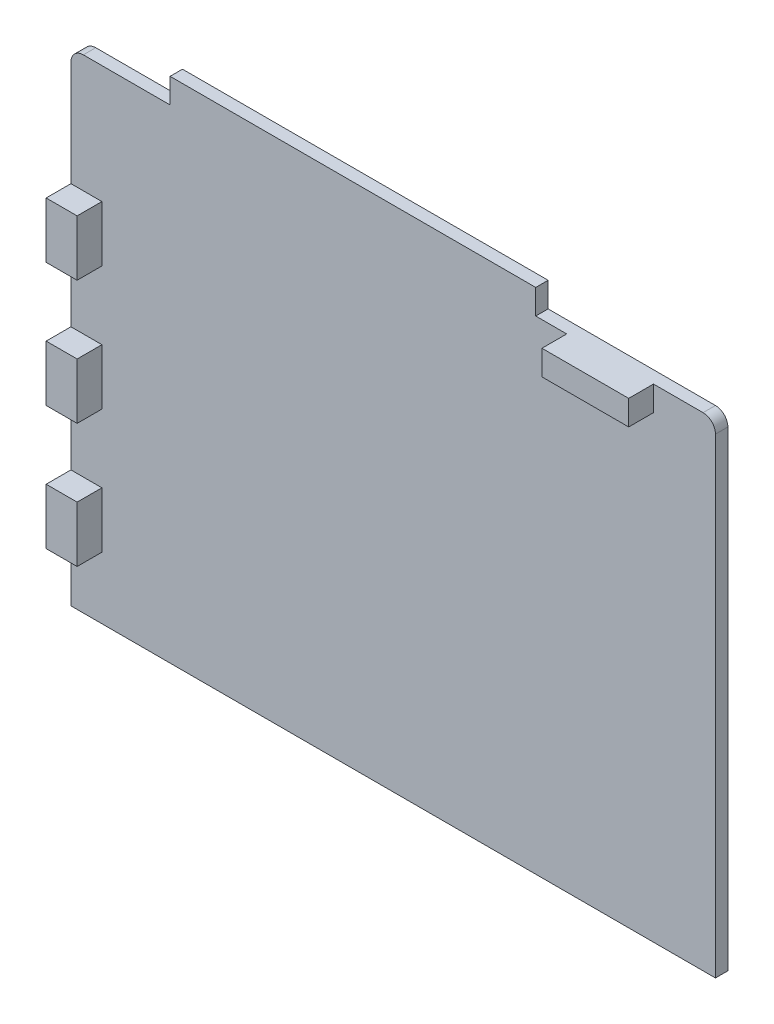
ISO-10303-21;
HEADER;
FILE_DESCRIPTION(('STEP AP214'),'2;1');
FILE_NAME('part.step','',(''),(''),'','','');
FILE_SCHEMA(('AUTOMOTIVE_DESIGN { 1 0 10303 214 1 1 1 1 }'));
ENDSEC;
DATA;
#1=APPLICATION_CONTEXT('core data for automotive mechanical design processes');
#2=APPLICATION_PROTOCOL_DEFINITION('international standard','automotive_design',2000,#1);
#3=PRODUCT_CONTEXT('',#1,'mechanical');
#4=PRODUCT('Part','Part','',(#3));
#5=PRODUCT_RELATED_PRODUCT_CATEGORY('part','',(#4));
#6=PRODUCT_DEFINITION_FORMATION('','',#4);
#7=PRODUCT_DEFINITION_CONTEXT('part definition',#1,'design');
#8=PRODUCT_DEFINITION('design','',#6,#7);
#9=PRODUCT_DEFINITION_SHAPE('','',#8);
#10=(LENGTH_UNIT() NAMED_UNIT(*) SI_UNIT(.MILLI.,.METRE.));
#11=(NAMED_UNIT(*) PLANE_ANGLE_UNIT() SI_UNIT($,.RADIAN.));
#12=(NAMED_UNIT(*) SI_UNIT($,.STERADIAN.) SOLID_ANGLE_UNIT());
#13=UNCERTAINTY_MEASURE_WITH_UNIT(LENGTH_MEASURE(1.E-05),#10,'distance_accuracy_value','');
#14=(GEOMETRIC_REPRESENTATION_CONTEXT(3) GLOBAL_UNCERTAINTY_ASSIGNED_CONTEXT((#13)) GLOBAL_UNIT_ASSIGNED_CONTEXT((#10,
#11,#12)) REPRESENTATION_CONTEXT('',''));
#15=CARTESIAN_POINT('',(0.,0.,0.));
#16=DIRECTION('',(0.,0.,1.));
#17=DIRECTION('',(1.,0.,0.));
#18=AXIS2_PLACEMENT_3D('',#15,#16,#17);
#19=CARTESIAN_POINT('',(-15.9067749788197,-11.1489450784484,0.));
#20=DIRECTION('',(-1.,0.,0.));
#21=DIRECTION('',(0.,1.,0.));
#22=AXIS2_PLACEMENT_3D('',#19,#20,#21);
#23=PLANE('',#22);
#24=DIRECTION('',(0.,-1.,0.));
#25=VECTOR('',#24,1.);
#26=CARTESIAN_POINT('',(-15.9067749788197,-5.53896634470686,0.));
#27=LINE('',#26,#25);
#28=CARTESIAN_POINT('',(-15.9067749788197,-5.53896634470686,0.));
#29=VERTEX_POINT('',#28);
#30=CARTESIAN_POINT('',(-15.9067749788197,-11.1489450784484,0.));
#31=VERTEX_POINT('',#30);
#32=EDGE_CURVE('E11',#29,#31,#27,.T.);
#33=ORIENTED_EDGE('',*,*,#32,.F.);
#34=DIRECTION('',(0.,0.,-1.));
#35=VECTOR('',#34,1.);
#36=CARTESIAN_POINT('',(-15.9067749788197,-5.53896634470686,0.));
#37=LINE('',#36,#35);
#38=CARTESIAN_POINT('',(-15.9067749788197,-5.53896634470686,-1.5));
#39=VERTEX_POINT('',#38);
#40=EDGE_CURVE('E25',#29,#39,#37,.T.);
#41=ORIENTED_EDGE('',*,*,#40,.T.);
#42=DIRECTION('',(0.,1.,0.));
#43=VECTOR('',#42,1.);
#44=CARTESIAN_POINT('',(-15.9067749788197,-11.1489450784484,-1.5));
#45=LINE('',#44,#43);
#46=CARTESIAN_POINT('',(-15.9067749788197,-11.1489450784484,-1.5));
#47=VERTEX_POINT('',#46);
#48=EDGE_CURVE('E612',#47,#39,#45,.T.);
#49=ORIENTED_EDGE('',*,*,#48,.F.);
#50=DIRECTION('',(0.,0.,-1.));
#51=VECTOR('',#50,1.);
#52=CARTESIAN_POINT('',(-15.9067749788197,-11.1489450784484,0.));
#53=LINE('',#52,#51);
#54=EDGE_CURVE('E607',#31,#47,#53,.T.);
#55=ORIENTED_EDGE('',*,*,#54,.F.);
#56=EDGE_LOOP('',(#33,#41,#49,#55));
#57=FACE_BOUND('',#56,.T.);
#58=ADVANCED_FACE('F17',(#57),#23,.T.);
#59=CARTESIAN_POINT('',(5.96504061705738,-11.1489450784484,0.));
#60=DIRECTION('',(0.,-1.,0.));
#61=DIRECTION('',(-1.,0.,0.));
#62=AXIS2_PLACEMENT_3D('',#59,#60,#61);
#63=PLANE('',#62);
#64=DIRECTION('',(1.,0.,0.));
#65=VECTOR('',#64,1.);
#66=CARTESIAN_POINT('',(-15.9067749788197,-11.1489450784484,0.));
#67=LINE('',#66,#65);
#68=CARTESIAN_POINT('',(5.96504061705738,-11.1489450784484,0.));
#69=VERTEX_POINT('',#68);
#70=EDGE_CURVE('E602',#31,#69,#67,.T.);
#71=ORIENTED_EDGE('',*,*,#70,.F.);
#72=ORIENTED_EDGE('',*,*,#54,.T.);
#73=DIRECTION('',(-1.,0.,0.));
#74=VECTOR('',#73,1.);
#75=CARTESIAN_POINT('',(5.96504061705738,-11.1489450784484,-1.5));
#76=LINE('',#75,#74);
#77=CARTESIAN_POINT('',(5.96504061705738,-11.1489450784484,-1.5));
#78=VERTEX_POINT('',#77);
#79=EDGE_CURVE('E597',#78,#47,#76,.T.);
#80=ORIENTED_EDGE('',*,*,#79,.F.);
#81=DIRECTION('',(0.,0.,-1.));
#82=VECTOR('',#81,1.);
#83=CARTESIAN_POINT('',(5.96504061705738,-11.1489450784484,0.));
#84=LINE('',#83,#82);
#85=EDGE_CURVE('E592',#69,#78,#84,.T.);
#86=ORIENTED_EDGE('',*,*,#85,.F.);
#87=EDGE_LOOP('',(#71,#72,#80,#86));
#88=FACE_BOUND('',#87,.T.);
#89=ADVANCED_FACE('F625',(#88),#63,.T.);
#90=CARTESIAN_POINT('',(5.96504061705738,-5.53896634470686,0.));
#91=DIRECTION('',(1.,0.,0.));
#92=DIRECTION('',(0.,-1.,0.));
#93=AXIS2_PLACEMENT_3D('',#90,#91,#92);
#94=PLANE('',#93);
#95=DIRECTION('',(0.,1.,0.));
#96=VECTOR('',#95,1.);
#97=CARTESIAN_POINT('',(5.96504061705738,-11.1489450784484,0.));
#98=LINE('',#97,#96);
#99=CARTESIAN_POINT('',(5.96504061705738,-5.53896634470686,0.));
#100=VERTEX_POINT('',#99);
#101=EDGE_CURVE('E587',#69,#100,#98,.T.);
#102=ORIENTED_EDGE('',*,*,#101,.F.);
#103=ORIENTED_EDGE('',*,*,#85,.T.);
#104=DIRECTION('',(0.,-1.,0.));
#105=VECTOR('',#104,1.);
#106=CARTESIAN_POINT('',(5.96504061705738,-5.53896634470686,-1.5));
#107=LINE('',#106,#105);
#108=CARTESIAN_POINT('',(5.96504061705738,-5.53896634470686,-1.5));
#109=VERTEX_POINT('',#108);
#110=EDGE_CURVE('E582',#109,#78,#107,.T.);
#111=ORIENTED_EDGE('',*,*,#110,.F.);
#112=DIRECTION('',(0.,0.,-1.));
#113=VECTOR('',#112,1.);
#114=CARTESIAN_POINT('',(5.96504061705738,-5.53896634470686,0.));
#115=LINE('',#114,#113);
#116=EDGE_CURVE('E577',#100,#109,#115,.T.);
#117=ORIENTED_EDGE('',*,*,#116,.F.);
#118=EDGE_LOOP('',(#102,#103,#111,#117));
#119=FACE_BOUND('',#118,.T.);
#120=ADVANCED_FACE('F633',(#119),#94,.T.);
#121=CARTESIAN_POINT('',(-15.9067749788197,-5.53896634470686,0.));
#122=DIRECTION('',(0.,1.,0.));
#123=DIRECTION('',(1.,0.,0.));
#124=AXIS2_PLACEMENT_3D('',#121,#122,#123);
#125=PLANE('',#124);
#126=DIRECTION('',(-1.,0.,0.));
#127=VECTOR('',#126,1.);
#128=CARTESIAN_POINT('',(5.96504061705738,-5.53896634470686,0.));
#129=LINE('',#128,#127);
#130=EDGE_CURVE('E572',#100,#29,#129,.T.);
#131=ORIENTED_EDGE('',*,*,#130,.F.);
#132=ORIENTED_EDGE('',*,*,#116,.T.);
#133=DIRECTION('',(1.,0.,0.));
#134=VECTOR('',#133,1.);
#135=CARTESIAN_POINT('',(-15.9067749788197,-5.53896634470686,-1.5));
#136=LINE('',#135,#134);
#137=EDGE_CURVE('E567',#39,#109,#136,.T.);
#138=ORIENTED_EDGE('',*,*,#137,.F.);
#139=ORIENTED_EDGE('',*,*,#40,.F.);
#140=EDGE_LOOP('',(#131,#132,#138,#139));
#141=FACE_BOUND('',#140,.T.);
#142=ADVANCED_FACE('F631',(#141),#125,.T.);
#143=CARTESIAN_POINT('',(-4.97086718088115,-8.34395571157763,-1.5));
#144=DIRECTION('',(0.,0.,-1.));
#145=DIRECTION('',(-1.,0.,0.));
#146=AXIS2_PLACEMENT_3D('',#143,#144,#145);
#147=PLANE('',#146);
#148=ORIENTED_EDGE('',*,*,#137,.T.);
#149=ORIENTED_EDGE('',*,*,#110,.T.);
#150=ORIENTED_EDGE('',*,*,#79,.T.);
#151=ORIENTED_EDGE('',*,*,#48,.T.);
#152=EDGE_LOOP('',(#148,#149,#150,#151));
#153=FACE_BOUND('',#152,.T.);
#154=ADVANCED_FACE('F622',(#153),#147,.T.);
#155=CARTESIAN_POINT('',(0.,0.,0.));
#156=DIRECTION('',(0.,0.,1.));
#157=DIRECTION('',(1.,0.,0.));
#158=AXIS2_PLACEMENT_3D('',#155,#156,#157);
#159=PLANE('',#158);
#160=CARTESIAN_POINT('',(-25.,17.5,0.));
#161=DIRECTION('',(0.,0.,1.));
#162=DIRECTION('',(-0.707106781186549,0.707106781186546,0.));
#163=AXIS2_PLACEMENT_3D('',#160,#161,#162);
#164=CIRCLE('',#163,1.);
#165=CARTESIAN_POINT('',(-25.,18.5,0.));
#166=VERTEX_POINT('',#165);
#167=CARTESIAN_POINT('',(-26.,17.5,0.));
#168=VERTEX_POINT('',#167);
#169=EDGE_CURVE('E562',#166,#168,#164,.T.);
#170=ORIENTED_EDGE('',*,*,#169,.F.);
#171=DIRECTION('',(1.,0.,0.));
#172=VECTOR('',#171,1.);
#173=CARTESIAN_POINT('',(-25.,18.5,0.));
#174=LINE('',#173,#172);
#175=CARTESIAN_POINT('',(-18.,18.5,0.));
#176=VERTEX_POINT('',#175);
#177=EDGE_CURVE('E558',#166,#176,#174,.T.);
#178=ORIENTED_EDGE('',*,*,#177,.T.);
#179=DIRECTION('',(0.,1.,0.));
#180=VECTOR('',#179,1.);
#181=CARTESIAN_POINT('',(-18.,18.5,0.));
#182=LINE('',#181,#180);
#183=CARTESIAN_POINT('',(-18.,20.5,0.));
#184=VERTEX_POINT('',#183);
#185=EDGE_CURVE('E554',#176,#184,#182,.T.);
#186=ORIENTED_EDGE('',*,*,#185,.T.);
#187=DIRECTION('',(-1.,0.,0.));
#188=VECTOR('',#187,1.);
#189=CARTESIAN_POINT('',(11.5,20.5,0.));
#190=LINE('',#189,#188);
#191=CARTESIAN_POINT('',(11.5,20.5,0.));
#192=VERTEX_POINT('',#191);
#193=EDGE_CURVE('E549',#192,#184,#190,.T.);
#194=ORIENTED_EDGE('',*,*,#193,.F.);
#195=DIRECTION('',(0.,-1.,0.));
#196=VECTOR('',#195,1.);
#197=CARTESIAN_POINT('',(11.5,20.5,0.));
#198=LINE('',#197,#196);
#199=CARTESIAN_POINT('',(11.5,18.5,0.));
#200=VERTEX_POINT('',#199);
#201=EDGE_CURVE('E545',#192,#200,#198,.T.);
#202=ORIENTED_EDGE('',*,*,#201,.T.);
#203=DIRECTION('',(1.,0.,0.));
#204=VECTOR('',#203,1.);
#205=CARTESIAN_POINT('',(11.5,18.5,0.));
#206=LINE('',#205,#204);
#207=CARTESIAN_POINT('',(25.,18.5,0.));
#208=VERTEX_POINT('',#207);
#209=EDGE_CURVE('E541',#200,#208,#206,.T.);
#210=ORIENTED_EDGE('',*,*,#209,.T.);
#211=CARTESIAN_POINT('',(25.,17.5,0.));
#212=DIRECTION('',(0.,0.,1.));
#213=DIRECTION('',(0.707106781186546,0.707106781186549,0.));
#214=AXIS2_PLACEMENT_3D('',#211,#212,#213);
#215=CIRCLE('',#214,1.);
#216=CARTESIAN_POINT('',(26.,17.5,0.));
#217=VERTEX_POINT('',#216);
#218=EDGE_CURVE('E536',#217,#208,#215,.T.);
#219=ORIENTED_EDGE('',*,*,#218,.F.);
#220=DIRECTION('',(0.,1.,0.));
#221=VECTOR('',#220,1.);
#222=CARTESIAN_POINT('',(26.,-20.5,0.));
#223=LINE('',#222,#221);
#224=CARTESIAN_POINT('',(26.,-20.5,0.));
#225=VERTEX_POINT('',#224);
#226=EDGE_CURVE('E531',#225,#217,#223,.T.);
#227=ORIENTED_EDGE('',*,*,#226,.F.);
#228=DIRECTION('',(1.,0.,0.));
#229=VECTOR('',#228,1.);
#230=CARTESIAN_POINT('',(-26.,-20.5,0.));
#231=LINE('',#230,#229);
#232=CARTESIAN_POINT('',(-26.,-20.5,0.));
#233=VERTEX_POINT('',#232);
#234=EDGE_CURVE('E526',#233,#225,#231,.T.);
#235=ORIENTED_EDGE('',*,*,#234,.F.);
#236=DIRECTION('',(0.,-1.,0.));
#237=VECTOR('',#236,1.);
#238=CARTESIAN_POINT('',(-26.,17.5,0.));
#239=LINE('',#238,#237);
#240=EDGE_CURVE('E521',#168,#233,#239,.T.);
#241=ORIENTED_EDGE('',*,*,#240,.F.);
#242=EDGE_LOOP('',(#170,#178,#186,#194,#202,#210,#219,#227,#235,#241));
#243=FACE_BOUND('',#242,.T.);
#244=ORIENTED_EDGE('',*,*,#32,.T.);
#245=ORIENTED_EDGE('',*,*,#70,.T.);
#246=ORIENTED_EDGE('',*,*,#101,.T.);
#247=ORIENTED_EDGE('',*,*,#130,.T.);
#248=EDGE_LOOP('',(#244,#245,#246,#247));
#249=FACE_BOUND('',#248,.T.);
#250=ADVANCED_FACE('F628',(#243,#249),#159,.F.);
#251=CARTESIAN_POINT('',(-26.,20.5,0.));
#252=DIRECTION('',(-1.,0.,0.));
#253=DIRECTION('',(0.,-1.,0.));
#254=AXIS2_PLACEMENT_3D('',#251,#252,#253);
#255=PLANE('',#254);
#256=DIRECTION('',(0.,0.,1.));
#257=VECTOR('',#256,1.);
#258=CARTESIAN_POINT('',(-26.,17.5,0.));
#259=LINE('',#258,#257);
#260=CARTESIAN_POINT('',(-26.,17.5,1.));
#261=VERTEX_POINT('',#260);
#262=EDGE_CURVE('E516',#168,#261,#259,.T.);
#263=ORIENTED_EDGE('',*,*,#262,.F.);
#264=ORIENTED_EDGE('',*,*,#240,.T.);
#265=DIRECTION('',(0.,0.,1.));
#266=VECTOR('',#265,1.);
#267=CARTESIAN_POINT('',(-26.,-20.5,0.));
#268=LINE('',#267,#266);
#269=CARTESIAN_POINT('',(-26.,-20.5,1.));
#270=VERTEX_POINT('',#269);
#271=EDGE_CURVE('E512',#233,#270,#268,.T.);
#272=ORIENTED_EDGE('',*,*,#271,.T.);
#273=DIRECTION('',(0.,-1.,0.));
#274=VECTOR('',#273,1.);
#275=CARTESIAN_POINT('',(-26.,-15.5,1.));
#276=LINE('',#275,#274);
#277=CARTESIAN_POINT('',(-26.,-15.5,1.));
#278=VERTEX_POINT('',#277);
#279=EDGE_CURVE('E507',#278,#270,#276,.T.);
#280=ORIENTED_EDGE('',*,*,#279,.F.);
#281=DIRECTION('',(0.,0.,1.));
#282=VECTOR('',#281,1.);
#283=CARTESIAN_POINT('',(-26.,-15.5,1.));
#284=LINE('',#283,#282);
#285=CARTESIAN_POINT('',(-26.,-15.5,3.));
#286=VERTEX_POINT('',#285);
#287=EDGE_CURVE('E503',#278,#286,#284,.T.);
#288=ORIENTED_EDGE('',*,*,#287,.T.);
#289=DIRECTION('',(0.,-1.,0.));
#290=VECTOR('',#289,1.);
#291=CARTESIAN_POINT('',(-26.,-11.,3.));
#292=LINE('',#291,#290);
#293=CARTESIAN_POINT('',(-26.,-11.,3.));
#294=VERTEX_POINT('',#293);
#295=EDGE_CURVE('E498',#294,#286,#292,.T.);
#296=ORIENTED_EDGE('',*,*,#295,.F.);
#297=DIRECTION('',(0.,0.,1.));
#298=VECTOR('',#297,1.);
#299=CARTESIAN_POINT('',(-26.,-11.,1.));
#300=LINE('',#299,#298);
#301=CARTESIAN_POINT('',(-26.,-11.,1.));
#302=VERTEX_POINT('',#301);
#303=EDGE_CURVE('E493',#302,#294,#300,.T.);
#304=ORIENTED_EDGE('',*,*,#303,.F.);
#305=DIRECTION('',(0.,-1.,0.));
#306=VECTOR('',#305,1.);
#307=CARTESIAN_POINT('',(-26.,-5.5,1.));
#308=LINE('',#307,#306);
#309=CARTESIAN_POINT('',(-26.,-5.5,1.));
#310=VERTEX_POINT('',#309);
#311=EDGE_CURVE('E488',#310,#302,#308,.T.);
#312=ORIENTED_EDGE('',*,*,#311,.F.);
#313=DIRECTION('',(0.,0.,1.));
#314=VECTOR('',#313,1.);
#315=CARTESIAN_POINT('',(-26.,-5.5,1.));
#316=LINE('',#315,#314);
#317=CARTESIAN_POINT('',(-26.,-5.5,3.));
#318=VERTEX_POINT('',#317);
#319=EDGE_CURVE('E484',#310,#318,#316,.T.);
#320=ORIENTED_EDGE('',*,*,#319,.T.);
#321=DIRECTION('',(0.,-1.,0.));
#322=VECTOR('',#321,1.);
#323=CARTESIAN_POINT('',(-26.,-1.,3.));
#324=LINE('',#323,#322);
#325=CARTESIAN_POINT('',(-26.,-1.,3.));
#326=VERTEX_POINT('',#325);
#327=EDGE_CURVE('E479',#326,#318,#324,.T.);
#328=ORIENTED_EDGE('',*,*,#327,.F.);
#329=DIRECTION('',(0.,0.,1.));
#330=VECTOR('',#329,1.);
#331=CARTESIAN_POINT('',(-26.,-1.,1.));
#332=LINE('',#331,#330);
#333=CARTESIAN_POINT('',(-26.,-1.,1.));
#334=VERTEX_POINT('',#333);
#335=EDGE_CURVE('E474',#334,#326,#332,.T.);
#336=ORIENTED_EDGE('',*,*,#335,.F.);
#337=DIRECTION('',(0.,-1.,0.));
#338=VECTOR('',#337,1.);
#339=CARTESIAN_POINT('',(-26.,4.49999999999999,1.));
#340=LINE('',#339,#338);
#341=CARTESIAN_POINT('',(-26.,4.49999999999999,1.));
#342=VERTEX_POINT('',#341);
#343=EDGE_CURVE('E469',#342,#334,#340,.T.);
#344=ORIENTED_EDGE('',*,*,#343,.F.);
#345=DIRECTION('',(0.,0.,1.));
#346=VECTOR('',#345,1.);
#347=CARTESIAN_POINT('',(-26.,4.49999999999999,1.));
#348=LINE('',#347,#346);
#349=CARTESIAN_POINT('',(-26.,4.49999999999999,3.));
#350=VERTEX_POINT('',#349);
#351=EDGE_CURVE('E465',#342,#350,#348,.T.);
#352=ORIENTED_EDGE('',*,*,#351,.T.);
#353=DIRECTION('',(0.,-1.,0.));
#354=VECTOR('',#353,1.);
#355=CARTESIAN_POINT('',(-26.,9.,3.));
#356=LINE('',#355,#354);
#357=CARTESIAN_POINT('',(-26.,9.,3.));
#358=VERTEX_POINT('',#357);
#359=EDGE_CURVE('E460',#358,#350,#356,.T.);
#360=ORIENTED_EDGE('',*,*,#359,.F.);
#361=DIRECTION('',(0.,0.,1.));
#362=VECTOR('',#361,1.);
#363=CARTESIAN_POINT('',(-26.,9.,1.));
#364=LINE('',#363,#362);
#365=CARTESIAN_POINT('',(-26.,9.,1.));
#366=VERTEX_POINT('',#365);
#367=EDGE_CURVE('E455',#366,#358,#364,.T.);
#368=ORIENTED_EDGE('',*,*,#367,.F.);
#369=DIRECTION('',(0.,-1.,0.));
#370=VECTOR('',#369,1.);
#371=CARTESIAN_POINT('',(-26.,17.5,1.));
#372=LINE('',#371,#370);
#373=EDGE_CURVE('E450',#261,#366,#372,.T.);
#374=ORIENTED_EDGE('',*,*,#373,.F.);
#375=EDGE_LOOP('',(#263,#264,#272,#280,#288,#296,#304,#312,#320,#328,#336,#344,#352,#360,#368,#374));
#376=FACE_BOUND('',#375,.T.);
#377=ADVANCED_FACE('F687',(#376),#255,.T.);
#378=CARTESIAN_POINT('',(0.,0.,1.));
#379=DIRECTION('',(0.,0.,1.));
#380=DIRECTION('',(1.,0.,0.));
#381=AXIS2_PLACEMENT_3D('',#378,#379,#380);
#382=PLANE('',#381);
#383=DIRECTION('',(-1.,0.,0.));
#384=VECTOR('',#383,1.);
#385=CARTESIAN_POINT('',(-23.5,-15.5,1.));
#386=LINE('',#385,#384);
#387=CARTESIAN_POINT('',(-23.5,-15.5,1.));
#388=VERTEX_POINT('',#387);
#389=EDGE_CURVE('E445',#388,#278,#386,.T.);
#390=ORIENTED_EDGE('',*,*,#389,.T.);
#391=ORIENTED_EDGE('',*,*,#279,.T.);
#392=DIRECTION('',(1.,0.,0.));
#393=VECTOR('',#392,1.);
#394=CARTESIAN_POINT('',(-26.,-20.5,1.));
#395=LINE('',#394,#393);
#396=CARTESIAN_POINT('',(26.,-20.5,1.));
#397=VERTEX_POINT('',#396);
#398=EDGE_CURVE('E441',#270,#397,#395,.T.);
#399=ORIENTED_EDGE('',*,*,#398,.T.);
#400=DIRECTION('',(0.,1.,0.));
#401=VECTOR('',#400,1.);
#402=CARTESIAN_POINT('',(26.,-20.5,1.));
#403=LINE('',#402,#401);
#404=CARTESIAN_POINT('',(26.,17.5,1.));
#405=VERTEX_POINT('',#404);
#406=EDGE_CURVE('E437',#397,#405,#403,.T.);
#407=ORIENTED_EDGE('',*,*,#406,.T.);
#408=CARTESIAN_POINT('',(25.,17.5,1.));
#409=DIRECTION('',(0.,0.,-1.));
#410=DIRECTION('',(0.707106781186546,0.707106781186549,0.));
#411=AXIS2_PLACEMENT_3D('',#408,#409,#410);
#412=CIRCLE('',#411,1.);
#413=CARTESIAN_POINT('',(25.,18.5,1.));
#414=VERTEX_POINT('',#413);
#415=EDGE_CURVE('E432',#414,#405,#412,.T.);
#416=ORIENTED_EDGE('',*,*,#415,.F.);
#417=DIRECTION('',(-1.,0.,0.));
#418=VECTOR('',#417,1.);
#419=CARTESIAN_POINT('',(25.,18.5,1.));
#420=LINE('',#419,#418);
#421=CARTESIAN_POINT('',(21.,18.5,1.));
#422=VERTEX_POINT('',#421);
#423=EDGE_CURVE('E428',#414,#422,#420,.T.);
#424=ORIENTED_EDGE('',*,*,#423,.T.);
#425=DIRECTION('',(0.,-1.,0.));
#426=VECTOR('',#425,1.);
#427=CARTESIAN_POINT('',(21.,18.5,1.));
#428=LINE('',#427,#426);
#429=CARTESIAN_POINT('',(21.,16.5,1.));
#430=VERTEX_POINT('',#429);
#431=EDGE_CURVE('E424',#422,#430,#428,.T.);
#432=ORIENTED_EDGE('',*,*,#431,.T.);
#433=DIRECTION('',(-1.,0.,0.));
#434=VECTOR('',#433,1.);
#435=CARTESIAN_POINT('',(21.,16.5,1.));
#436=LINE('',#435,#434);
#437=CARTESIAN_POINT('',(14.,16.5,1.));
#438=VERTEX_POINT('',#437);
#439=EDGE_CURVE('E420',#430,#438,#436,.T.);
#440=ORIENTED_EDGE('',*,*,#439,.T.);
#441=DIRECTION('',(0.,1.,0.));
#442=VECTOR('',#441,1.);
#443=CARTESIAN_POINT('',(14.,16.5,1.));
#444=LINE('',#443,#442);
#445=CARTESIAN_POINT('',(14.,18.5,1.));
#446=VERTEX_POINT('',#445);
#447=EDGE_CURVE('E232',#438,#446,#444,.T.);
#448=ORIENTED_EDGE('',*,*,#447,.T.);
#449=DIRECTION('',(-1.,0.,0.));
#450=VECTOR('',#449,1.);
#451=CARTESIAN_POINT('',(14.,18.5,1.));
#452=LINE('',#451,#450);
#453=CARTESIAN_POINT('',(11.5,18.5,1.));
#454=VERTEX_POINT('',#453);
#455=EDGE_CURVE('E413',#446,#454,#452,.T.);
#456=ORIENTED_EDGE('',*,*,#455,.T.);
#457=DIRECTION('',(0.,1.,0.));
#458=VECTOR('',#457,1.);
#459=CARTESIAN_POINT('',(11.5,18.5,1.));
#460=LINE('',#459,#458);
#461=CARTESIAN_POINT('',(11.5,20.5,1.));
#462=VERTEX_POINT('',#461);
#463=EDGE_CURVE('E409',#454,#462,#460,.T.);
#464=ORIENTED_EDGE('',*,*,#463,.T.);
#465=DIRECTION('',(-1.,0.,0.));
#466=VECTOR('',#465,1.);
#467=CARTESIAN_POINT('',(11.5,20.5,1.));
#468=LINE('',#467,#466);
#469=CARTESIAN_POINT('',(-18.,20.5,1.));
#470=VERTEX_POINT('',#469);
#471=EDGE_CURVE('E405',#462,#470,#468,.T.);
#472=ORIENTED_EDGE('',*,*,#471,.T.);
#473=DIRECTION('',(0.,-1.,0.));
#474=VECTOR('',#473,1.);
#475=CARTESIAN_POINT('',(-18.,20.5,1.));
#476=LINE('',#475,#474);
#477=CARTESIAN_POINT('',(-18.,18.5,1.));
#478=VERTEX_POINT('',#477);
#479=EDGE_CURVE('E401',#470,#478,#476,.T.);
#480=ORIENTED_EDGE('',*,*,#479,.T.);
#481=DIRECTION('',(-1.,0.,0.));
#482=VECTOR('',#481,1.);
#483=CARTESIAN_POINT('',(-18.,18.5,1.));
#484=LINE('',#483,#482);
#485=CARTESIAN_POINT('',(-25.,18.5,1.));
#486=VERTEX_POINT('',#485);
#487=EDGE_CURVE('E397',#478,#486,#484,.T.);
#488=ORIENTED_EDGE('',*,*,#487,.T.);
#489=CARTESIAN_POINT('',(-25.,17.5,1.));
#490=DIRECTION('',(0.,0.,-1.));
#491=DIRECTION('',(-0.707106781186549,0.707106781186546,0.));
#492=AXIS2_PLACEMENT_3D('',#489,#490,#491);
#493=CIRCLE('',#492,1.);
#494=EDGE_CURVE('E392',#261,#486,#493,.T.);
#495=ORIENTED_EDGE('',*,*,#494,.F.);
#496=ORIENTED_EDGE('',*,*,#373,.T.);
#497=DIRECTION('',(1.,0.,0.));
#498=VECTOR('',#497,1.);
#499=CARTESIAN_POINT('',(-26.,9.,1.));
#500=LINE('',#499,#498);
#501=CARTESIAN_POINT('',(-23.5,9.,1.));
#502=VERTEX_POINT('',#501);
#503=EDGE_CURVE('E388',#366,#502,#500,.T.);
#504=ORIENTED_EDGE('',*,*,#503,.T.);
#505=DIRECTION('',(0.,-1.,0.));
#506=VECTOR('',#505,1.);
#507=CARTESIAN_POINT('',(-23.5,9.,1.));
#508=LINE('',#507,#506);
#509=CARTESIAN_POINT('',(-23.5,4.5,1.));
#510=VERTEX_POINT('',#509);
#511=EDGE_CURVE('E384',#502,#510,#508,.T.);
#512=ORIENTED_EDGE('',*,*,#511,.T.);
#513=DIRECTION('',(-1.,0.,0.));
#514=VECTOR('',#513,1.);
#515=CARTESIAN_POINT('',(-23.5,4.5,1.));
#516=LINE('',#515,#514);
#517=EDGE_CURVE('E379',#510,#342,#516,.T.);
#518=ORIENTED_EDGE('',*,*,#517,.T.);
#519=ORIENTED_EDGE('',*,*,#343,.T.);
#520=DIRECTION('',(1.,0.,0.));
#521=VECTOR('',#520,1.);
#522=CARTESIAN_POINT('',(-26.,-1.,1.));
#523=LINE('',#522,#521);
#524=CARTESIAN_POINT('',(-23.5,-1.,1.));
#525=VERTEX_POINT('',#524);
#526=EDGE_CURVE('E375',#334,#525,#523,.T.);
#527=ORIENTED_EDGE('',*,*,#526,.T.);
#528=DIRECTION('',(0.,-1.,0.));
#529=VECTOR('',#528,1.);
#530=CARTESIAN_POINT('',(-23.5,-1.,1.));
#531=LINE('',#530,#529);
#532=CARTESIAN_POINT('',(-23.5,-5.5,1.));
#533=VERTEX_POINT('',#532);
#534=EDGE_CURVE('E371',#525,#533,#531,.T.);
#535=ORIENTED_EDGE('',*,*,#534,.T.);
#536=DIRECTION('',(-1.,0.,0.));
#537=VECTOR('',#536,1.);
#538=CARTESIAN_POINT('',(-23.5,-5.5,1.));
#539=LINE('',#538,#537);
#540=EDGE_CURVE('E366',#533,#310,#539,.T.);
#541=ORIENTED_EDGE('',*,*,#540,.T.);
#542=ORIENTED_EDGE('',*,*,#311,.T.);
#543=DIRECTION('',(1.,0.,0.));
#544=VECTOR('',#543,1.);
#545=CARTESIAN_POINT('',(-26.,-11.,1.));
#546=LINE('',#545,#544);
#547=CARTESIAN_POINT('',(-23.5,-11.,1.));
#548=VERTEX_POINT('',#547);
#549=EDGE_CURVE('E362',#302,#548,#546,.T.);
#550=ORIENTED_EDGE('',*,*,#549,.T.);
#551=DIRECTION('',(0.,-1.,0.));
#552=VECTOR('',#551,1.);
#553=CARTESIAN_POINT('',(-23.5,-11.,1.));
#554=LINE('',#553,#552);
#555=EDGE_CURVE('E358',#548,#388,#554,.T.);
#556=ORIENTED_EDGE('',*,*,#555,.T.);
#557=EDGE_LOOP('',(#390,#391,#399,#407,#416,#424,#432,#440,#448,#456,#464,#472,#480,#488,#495,
#496,#504,#512,#518,#519,#527,#535,#541,#542,#550,#556));
#558=FACE_BOUND('',#557,.T.);
#559=ADVANCED_FACE('F697',(#558),#382,.T.);
#560=CARTESIAN_POINT('',(-23.5,-15.5,1.));
#561=DIRECTION('',(1.,0.,0.));
#562=DIRECTION('',(0.,1.,0.));
#563=AXIS2_PLACEMENT_3D('',#560,#561,#562);
#564=PLANE('',#563);
#565=ORIENTED_EDGE('',*,*,#555,.F.);
#566=DIRECTION('',(0.,0.,1.));
#567=VECTOR('',#566,1.);
#568=CARTESIAN_POINT('',(-23.5,-11.,1.));
#569=LINE('',#568,#567);
#570=CARTESIAN_POINT('',(-23.5,-11.,3.));
#571=VERTEX_POINT('',#570);
#572=EDGE_CURVE('E354',#548,#571,#569,.T.);
#573=ORIENTED_EDGE('',*,*,#572,.T.);
#574=DIRECTION('',(0.,1.,0.));
#575=VECTOR('',#574,1.);
#576=CARTESIAN_POINT('',(-23.5,-15.5,3.));
#577=LINE('',#576,#575);
#578=CARTESIAN_POINT('',(-23.5,-15.5,3.));
#579=VERTEX_POINT('',#578);
#580=EDGE_CURVE('E349',#579,#571,#577,.T.);
#581=ORIENTED_EDGE('',*,*,#580,.F.);
#582=DIRECTION('',(0.,0.,1.));
#583=VECTOR('',#582,1.);
#584=CARTESIAN_POINT('',(-23.5,-15.5,1.));
#585=LINE('',#584,#583);
#586=EDGE_CURVE('E344',#388,#579,#585,.T.);
#587=ORIENTED_EDGE('',*,*,#586,.F.);
#588=EDGE_LOOP('',(#565,#573,#581,#587));
#589=FACE_BOUND('',#588,.T.);
#590=ADVANCED_FACE('F707',(#589),#564,.T.);
#591=CARTESIAN_POINT('',(-26.,-15.5,1.));
#592=DIRECTION('',(0.,-1.,0.));
#593=DIRECTION('',(1.,0.,0.));
#594=AXIS2_PLACEMENT_3D('',#591,#592,#593);
#595=PLANE('',#594);
#596=ORIENTED_EDGE('',*,*,#389,.F.);
#597=ORIENTED_EDGE('',*,*,#586,.T.);
#598=DIRECTION('',(1.,0.,0.));
#599=VECTOR('',#598,1.);
#600=CARTESIAN_POINT('',(-26.,-15.5,3.));
#601=LINE('',#600,#599);
#602=EDGE_CURVE('E339',#286,#579,#601,.T.);
#603=ORIENTED_EDGE('',*,*,#602,.F.);
#604=ORIENTED_EDGE('',*,*,#287,.F.);
#605=EDGE_LOOP('',(#596,#597,#603,#604));
#606=FACE_BOUND('',#605,.T.);
#607=ADVANCED_FACE('F717',(#606),#595,.T.);
#608=CARTESIAN_POINT('',(-24.75,-13.25,3.));
#609=DIRECTION('',(0.,0.,1.));
#610=DIRECTION('',(1.,0.,0.));
#611=AXIS2_PLACEMENT_3D('',#608,#609,#610);
#612=PLANE('',#611);
#613=DIRECTION('',(-1.,0.,0.));
#614=VECTOR('',#613,1.);
#615=CARTESIAN_POINT('',(-23.5,-11.,3.));
#616=LINE('',#615,#614);
#617=EDGE_CURVE('E334',#571,#294,#616,.T.);
#618=ORIENTED_EDGE('',*,*,#617,.T.);
#619=ORIENTED_EDGE('',*,*,#295,.T.);
#620=ORIENTED_EDGE('',*,*,#602,.T.);
#621=ORIENTED_EDGE('',*,*,#580,.T.);
#622=EDGE_LOOP('',(#618,#619,#620,#621));
#623=FACE_BOUND('',#622,.T.);
#624=ADVANCED_FACE('F727',(#623),#612,.T.);
#625=CARTESIAN_POINT('',(-23.5,-11.,1.));
#626=DIRECTION('',(0.,1.,0.));
#627=DIRECTION('',(-1.,0.,0.));
#628=AXIS2_PLACEMENT_3D('',#625,#626,#627);
#629=PLANE('',#628);
#630=ORIENTED_EDGE('',*,*,#549,.F.);
#631=ORIENTED_EDGE('',*,*,#303,.T.);
#632=ORIENTED_EDGE('',*,*,#617,.F.);
#633=ORIENTED_EDGE('',*,*,#572,.F.);
#634=EDGE_LOOP('',(#630,#631,#632,#633));
#635=FACE_BOUND('',#634,.T.);
#636=ADVANCED_FACE('F737',(#635),#629,.T.);
#637=CARTESIAN_POINT('',(-26.,-5.5,1.));
#638=DIRECTION('',(0.,-1.,0.));
#639=DIRECTION('',(1.,0.,0.));
#640=AXIS2_PLACEMENT_3D('',#637,#638,#639);
#641=PLANE('',#640);
#642=ORIENTED_EDGE('',*,*,#540,.F.);
#643=DIRECTION('',(0.,0.,1.));
#644=VECTOR('',#643,1.);
#645=CARTESIAN_POINT('',(-23.5,-5.5,1.));
#646=LINE('',#645,#644);
#647=CARTESIAN_POINT('',(-23.5,-5.5,3.));
#648=VERTEX_POINT('',#647);
#649=EDGE_CURVE('E330',#533,#648,#646,.T.);
#650=ORIENTED_EDGE('',*,*,#649,.T.);
#651=DIRECTION('',(1.,0.,0.));
#652=VECTOR('',#651,1.);
#653=CARTESIAN_POINT('',(-26.,-5.5,3.));
#654=LINE('',#653,#652);
#655=EDGE_CURVE('E325',#318,#648,#654,.T.);
#656=ORIENTED_EDGE('',*,*,#655,.F.);
#657=ORIENTED_EDGE('',*,*,#319,.F.);
#658=EDGE_LOOP('',(#642,#650,#656,#657));
#659=FACE_BOUND('',#658,.T.);
#660=ADVANCED_FACE('F747',(#659),#641,.T.);
#661=CARTESIAN_POINT('',(-24.75,-3.25,3.));
#662=DIRECTION('',(0.,0.,1.));
#663=DIRECTION('',(1.,0.,0.));
#664=AXIS2_PLACEMENT_3D('',#661,#662,#663);
#665=PLANE('',#664);
#666=DIRECTION('',(-1.,0.,0.));
#667=VECTOR('',#666,1.);
#668=CARTESIAN_POINT('',(-23.5,-1.,3.));
#669=LINE('',#668,#667);
#670=CARTESIAN_POINT('',(-23.5,-1.,3.));
#671=VERTEX_POINT('',#670);
#672=EDGE_CURVE('E320',#671,#326,#669,.T.);
#673=ORIENTED_EDGE('',*,*,#672,.T.);
#674=ORIENTED_EDGE('',*,*,#327,.T.);
#675=ORIENTED_EDGE('',*,*,#655,.T.);
#676=DIRECTION('',(0.,1.,0.));
#677=VECTOR('',#676,1.);
#678=CARTESIAN_POINT('',(-23.5,-5.5,3.));
#679=LINE('',#678,#677);
#680=EDGE_CURVE('E316',#648,#671,#679,.T.);
#681=ORIENTED_EDGE('',*,*,#680,.T.);
#682=EDGE_LOOP('',(#673,#674,#675,#681));
#683=FACE_BOUND('',#682,.T.);
#684=ADVANCED_FACE('F757',(#683),#665,.T.);
#685=CARTESIAN_POINT('',(-23.5,-5.5,1.));
#686=DIRECTION('',(1.,0.,0.));
#687=DIRECTION('',(0.,1.,0.));
#688=AXIS2_PLACEMENT_3D('',#685,#686,#687);
#689=PLANE('',#688);
#690=ORIENTED_EDGE('',*,*,#534,.F.);
#691=DIRECTION('',(0.,0.,1.));
#692=VECTOR('',#691,1.);
#693=CARTESIAN_POINT('',(-23.5,-1.,1.));
#694=LINE('',#693,#692);
#695=EDGE_CURVE('E311',#525,#671,#694,.T.);
#696=ORIENTED_EDGE('',*,*,#695,.T.);
#697=ORIENTED_EDGE('',*,*,#680,.F.);
#698=ORIENTED_EDGE('',*,*,#649,.F.);
#699=EDGE_LOOP('',(#690,#696,#697,#698));
#700=FACE_BOUND('',#699,.T.);
#701=ADVANCED_FACE('F767',(#700),#689,.T.);
#702=CARTESIAN_POINT('',(-23.5,-1.,1.));
#703=DIRECTION('',(0.,1.,0.));
#704=DIRECTION('',(-1.,0.,0.));
#705=AXIS2_PLACEMENT_3D('',#702,#703,#704);
#706=PLANE('',#705);
#707=ORIENTED_EDGE('',*,*,#526,.F.);
#708=ORIENTED_EDGE('',*,*,#335,.T.);
#709=ORIENTED_EDGE('',*,*,#672,.F.);
#710=ORIENTED_EDGE('',*,*,#695,.F.);
#711=EDGE_LOOP('',(#707,#708,#709,#710));
#712=FACE_BOUND('',#711,.T.);
#713=ADVANCED_FACE('F777',(#712),#706,.T.);
#714=CARTESIAN_POINT('',(-26.,4.49999999999999,1.));
#715=DIRECTION('',(0.,-1.,0.));
#716=DIRECTION('',(1.,0.,0.));
#717=AXIS2_PLACEMENT_3D('',#714,#715,#716);
#718=PLANE('',#717);
#719=ORIENTED_EDGE('',*,*,#517,.F.);
#720=DIRECTION('',(0.,0.,1.));
#721=VECTOR('',#720,1.);
#722=CARTESIAN_POINT('',(-23.5,4.5,1.));
#723=LINE('',#722,#721);
#724=CARTESIAN_POINT('',(-23.5,4.5,3.));
#725=VERTEX_POINT('',#724);
#726=EDGE_CURVE('E307',#510,#725,#723,.T.);
#727=ORIENTED_EDGE('',*,*,#726,.T.);
#728=DIRECTION('',(1.,0.,0.));
#729=VECTOR('',#728,1.);
#730=CARTESIAN_POINT('',(-26.,4.49999999999999,3.));
#731=LINE('',#730,#729);
#732=EDGE_CURVE('E302',#350,#725,#731,.T.);
#733=ORIENTED_EDGE('',*,*,#732,.F.);
#734=ORIENTED_EDGE('',*,*,#351,.F.);
#735=EDGE_LOOP('',(#719,#727,#733,#734));
#736=FACE_BOUND('',#735,.T.);
#737=ADVANCED_FACE('F787',(#736),#718,.T.);
#738=CARTESIAN_POINT('',(-24.75,6.75,3.));
#739=DIRECTION('',(0.,0.,1.));
#740=DIRECTION('',(1.,0.,0.));
#741=AXIS2_PLACEMENT_3D('',#738,#739,#740);
#742=PLANE('',#741);
#743=DIRECTION('',(-1.,0.,0.));
#744=VECTOR('',#743,1.);
#745=CARTESIAN_POINT('',(-23.5,9.,3.));
#746=LINE('',#745,#744);
#747=CARTESIAN_POINT('',(-23.5,9.,3.));
#748=VERTEX_POINT('',#747);
#749=EDGE_CURVE('E297',#748,#358,#746,.T.);
#750=ORIENTED_EDGE('',*,*,#749,.T.);
#751=ORIENTED_EDGE('',*,*,#359,.T.);
#752=ORIENTED_EDGE('',*,*,#732,.T.);
#753=DIRECTION('',(0.,1.,0.));
#754=VECTOR('',#753,1.);
#755=CARTESIAN_POINT('',(-23.5,4.5,3.));
#756=LINE('',#755,#754);
#757=EDGE_CURVE('E293',#725,#748,#756,.T.);
#758=ORIENTED_EDGE('',*,*,#757,.T.);
#759=EDGE_LOOP('',(#750,#751,#752,#758));
#760=FACE_BOUND('',#759,.T.);
#761=ADVANCED_FACE('F797',(#760),#742,.T.);
#762=CARTESIAN_POINT('',(-23.5,4.5,1.));
#763=DIRECTION('',(1.,0.,0.));
#764=DIRECTION('',(0.,1.,0.));
#765=AXIS2_PLACEMENT_3D('',#762,#763,#764);
#766=PLANE('',#765);
#767=ORIENTED_EDGE('',*,*,#511,.F.);
#768=DIRECTION('',(0.,0.,1.));
#769=VECTOR('',#768,1.);
#770=CARTESIAN_POINT('',(-23.5,9.,1.));
#771=LINE('',#770,#769);
#772=EDGE_CURVE('E288',#502,#748,#771,.T.);
#773=ORIENTED_EDGE('',*,*,#772,.T.);
#774=ORIENTED_EDGE('',*,*,#757,.F.);
#775=ORIENTED_EDGE('',*,*,#726,.F.);
#776=EDGE_LOOP('',(#767,#773,#774,#775));
#777=FACE_BOUND('',#776,.T.);
#778=ADVANCED_FACE('F807',(#777),#766,.T.);
#779=CARTESIAN_POINT('',(-23.5,9.,1.));
#780=DIRECTION('',(0.,1.,0.));
#781=DIRECTION('',(-1.,0.,0.));
#782=AXIS2_PLACEMENT_3D('',#779,#780,#781);
#783=PLANE('',#782);
#784=ORIENTED_EDGE('',*,*,#503,.F.);
#785=ORIENTED_EDGE('',*,*,#367,.T.);
#786=ORIENTED_EDGE('',*,*,#749,.F.);
#787=ORIENTED_EDGE('',*,*,#772,.F.);
#788=EDGE_LOOP('',(#784,#785,#786,#787));
#789=FACE_BOUND('',#788,.T.);
#790=ADVANCED_FACE('F817',(#789),#783,.T.);
#791=CARTESIAN_POINT('',(-25.,17.5,1.00000001));
#792=DIRECTION('',(0.,0.,-1.));
#793=DIRECTION('',(0.70710678118655,-0.707106781186545,0.));
#794=AXIS2_PLACEMENT_3D('',#791,#792,#793);
#795=CYLINDRICAL_SURFACE('',#794,1.);
#796=ORIENTED_EDGE('',*,*,#169,.T.);
#797=ORIENTED_EDGE('',*,*,#262,.T.);
#798=ORIENTED_EDGE('',*,*,#494,.T.);
#799=DIRECTION('',(0.,0.,-1.));
#800=VECTOR('',#799,1.);
#801=CARTESIAN_POINT('',(-25.,18.5,1.));
#802=LINE('',#801,#800);
#803=EDGE_CURVE('E283',#486,#166,#802,.T.);
#804=ORIENTED_EDGE('',*,*,#803,.T.);
#805=EDGE_LOOP('',(#796,#797,#798,#804));
#806=FACE_BOUND('',#805,.T.);
#807=ADVANCED_FACE('F827',(#806),#795,.T.);
#808=CARTESIAN_POINT('',(-18.,18.5,1.));
#809=DIRECTION('',(0.,-1.,0.));
#810=DIRECTION('',(-1.,0.,0.));
#811=AXIS2_PLACEMENT_3D('',#808,#809,#810);
#812=PLANE('',#811);
#813=ORIENTED_EDGE('',*,*,#803,.F.);
#814=ORIENTED_EDGE('',*,*,#487,.F.);
#815=DIRECTION('',(0.,0.,-1.));
#816=VECTOR('',#815,1.);
#817=CARTESIAN_POINT('',(-18.,18.5,1.));
#818=LINE('',#817,#816);
#819=EDGE_CURVE('E278',#478,#176,#818,.T.);
#820=ORIENTED_EDGE('',*,*,#819,.T.);
#821=ORIENTED_EDGE('',*,*,#177,.F.);
#822=EDGE_LOOP('',(#813,#814,#820,#821));
#823=FACE_BOUND('',#822,.T.);
#824=ADVANCED_FACE('F837',(#823),#812,.F.);
#825=CARTESIAN_POINT('',(-18.,20.5,1.));
#826=DIRECTION('',(1.,0.,0.));
#827=DIRECTION('',(0.,-1.,0.));
#828=AXIS2_PLACEMENT_3D('',#825,#826,#827);
#829=PLANE('',#828);
#830=ORIENTED_EDGE('',*,*,#479,.F.);
#831=DIRECTION('',(0.,0.,1.));
#832=VECTOR('',#831,1.);
#833=CARTESIAN_POINT('',(-18.,20.5,0.));
#834=LINE('',#833,#832);
#835=EDGE_CURVE('E273',#184,#470,#834,.T.);
#836=ORIENTED_EDGE('',*,*,#835,.F.);
#837=ORIENTED_EDGE('',*,*,#185,.F.);
#838=ORIENTED_EDGE('',*,*,#819,.F.);
#839=EDGE_LOOP('',(#830,#836,#837,#838));
#840=FACE_BOUND('',#839,.T.);
#841=ADVANCED_FACE('F847',(#840),#829,.F.);
#842=CARTESIAN_POINT('',(26.,20.5,0.));
#843=DIRECTION('',(0.,1.,0.));
#844=DIRECTION('',(-1.,0.,0.));
#845=AXIS2_PLACEMENT_3D('',#842,#843,#844);
#846=PLANE('',#845);
#847=ORIENTED_EDGE('',*,*,#835,.T.);
#848=ORIENTED_EDGE('',*,*,#471,.F.);
#849=DIRECTION('',(0.,0.,-1.));
#850=VECTOR('',#849,1.);
#851=CARTESIAN_POINT('',(11.5,20.5,1.));
#852=LINE('',#851,#850);
#853=EDGE_CURVE('E268',#462,#192,#852,.T.);
#854=ORIENTED_EDGE('',*,*,#853,.T.);
#855=ORIENTED_EDGE('',*,*,#193,.T.);
#856=EDGE_LOOP('',(#847,#848,#854,#855));
#857=FACE_BOUND('',#856,.T.);
#858=ADVANCED_FACE('F857',(#857),#846,.T.);
#859=CARTESIAN_POINT('',(11.5,18.5,1.));
#860=DIRECTION('',(-1.,0.,0.));
#861=DIRECTION('',(0.,1.,0.));
#862=AXIS2_PLACEMENT_3D('',#859,#860,#861);
#863=PLANE('',#862);
#864=ORIENTED_EDGE('',*,*,#463,.F.);
#865=DIRECTION('',(0.,0.,-1.));
#866=VECTOR('',#865,1.);
#867=CARTESIAN_POINT('',(11.5,18.5,1.));
#868=LINE('',#867,#866);
#869=EDGE_CURVE('E263',#454,#200,#868,.T.);
#870=ORIENTED_EDGE('',*,*,#869,.T.);
#871=ORIENTED_EDGE('',*,*,#201,.F.);
#872=ORIENTED_EDGE('',*,*,#853,.F.);
#873=EDGE_LOOP('',(#864,#870,#871,#872));
#874=FACE_BOUND('',#873,.T.);
#875=ADVANCED_FACE('F867',(#874),#863,.F.);
#876=CARTESIAN_POINT('',(26.,18.5,1.));
#877=DIRECTION('',(0.,-1.,0.));
#878=DIRECTION('',(-1.,0.,0.));
#879=AXIS2_PLACEMENT_3D('',#876,#877,#878);
#880=PLANE('',#879);
#881=DIRECTION('',(0.,0.,1.));
#882=VECTOR('',#881,1.);
#883=CARTESIAN_POINT('',(25.,18.5,0.));
#884=LINE('',#883,#882);
#885=EDGE_CURVE('E258',#208,#414,#884,.T.);
#886=ORIENTED_EDGE('',*,*,#885,.F.);
#887=ORIENTED_EDGE('',*,*,#209,.F.);
#888=ORIENTED_EDGE('',*,*,#869,.F.);
#889=ORIENTED_EDGE('',*,*,#455,.F.);
#890=DIRECTION('',(0.,0.,1.));
#891=VECTOR('',#890,1.);
#892=CARTESIAN_POINT('',(14.,18.5,1.));
#893=LINE('',#892,#891);
#894=CARTESIAN_POINT('',(14.,18.5,3.));
#895=VERTEX_POINT('',#894);
#896=EDGE_CURVE('E254',#446,#895,#893,.T.);
#897=ORIENTED_EDGE('',*,*,#896,.T.);
#898=DIRECTION('',(-1.,0.,0.));
#899=VECTOR('',#898,1.);
#900=CARTESIAN_POINT('',(21.,18.5,3.));
#901=LINE('',#900,#899);
#902=CARTESIAN_POINT('',(21.,18.5,3.));
#903=VERTEX_POINT('',#902);
#904=EDGE_CURVE('E226',#903,#895,#901,.T.);
#905=ORIENTED_EDGE('',*,*,#904,.F.);
#906=DIRECTION('',(0.,0.,1.));
#907=VECTOR('',#906,1.);
#908=CARTESIAN_POINT('',(21.,18.5,1.));
#909=LINE('',#908,#907);
#910=EDGE_CURVE('E246',#422,#903,#909,.T.);
#911=ORIENTED_EDGE('',*,*,#910,.F.);
#912=ORIENTED_EDGE('',*,*,#423,.F.);
#913=EDGE_LOOP('',(#886,#887,#888,#889,#897,#905,#911,#912));
#914=FACE_BOUND('',#913,.T.);
#915=ADVANCED_FACE('F877',(#914),#880,.F.);
#916=CARTESIAN_POINT('',(21.,16.5,1.));
#917=DIRECTION('',(1.,0.,0.));
#918=DIRECTION('',(0.,1.,0.));
#919=AXIS2_PLACEMENT_3D('',#916,#917,#918);
#920=PLANE('',#919);
#921=ORIENTED_EDGE('',*,*,#431,.F.);
#922=ORIENTED_EDGE('',*,*,#910,.T.);
#923=DIRECTION('',(0.,1.,0.));
#924=VECTOR('',#923,1.);
#925=CARTESIAN_POINT('',(21.,16.5,3.));
#926=LINE('',#925,#924);
#927=CARTESIAN_POINT('',(21.,16.5,3.));
#928=VERTEX_POINT('',#927);
#929=EDGE_CURVE('E242',#928,#903,#926,.T.);
#930=ORIENTED_EDGE('',*,*,#929,.F.);
#931=DIRECTION('',(0.,0.,1.));
#932=VECTOR('',#931,1.);
#933=CARTESIAN_POINT('',(21.,16.5,1.));
#934=LINE('',#933,#932);
#935=EDGE_CURVE('E218',#430,#928,#934,.T.);
#936=ORIENTED_EDGE('',*,*,#935,.F.);
#937=EDGE_LOOP('',(#921,#922,#930,#936));
#938=FACE_BOUND('',#937,.T.);
#939=ADVANCED_FACE('F887',(#938),#920,.T.);
#940=CARTESIAN_POINT('',(14.,16.5,1.));
#941=DIRECTION('',(0.,-1.,0.));
#942=DIRECTION('',(1.,0.,0.));
#943=AXIS2_PLACEMENT_3D('',#940,#941,#942);
#944=PLANE('',#943);
#945=ORIENTED_EDGE('',*,*,#439,.F.);
#946=ORIENTED_EDGE('',*,*,#935,.T.);
#947=DIRECTION('',(1.,0.,0.));
#948=VECTOR('',#947,1.);
#949=CARTESIAN_POINT('',(14.,16.5,3.));
#950=LINE('',#949,#948);
#951=CARTESIAN_POINT('',(14.,16.5,3.));
#952=VERTEX_POINT('',#951);
#953=EDGE_CURVE('E210',#952,#928,#950,.T.);
#954=ORIENTED_EDGE('',*,*,#953,.F.);
#955=DIRECTION('',(0.,0.,1.));
#956=VECTOR('',#955,1.);
#957=CARTESIAN_POINT('',(14.,16.5,1.));
#958=LINE('',#957,#956);
#959=EDGE_CURVE('E215',#438,#952,#958,.T.);
#960=ORIENTED_EDGE('',*,*,#959,.F.);
#961=EDGE_LOOP('',(#945,#946,#954,#960));
#962=FACE_BOUND('',#961,.T.);
#963=ADVANCED_FACE('F213',(#962),#944,.T.);
#964=CARTESIAN_POINT('',(14.,18.5,1.));
#965=DIRECTION('',(-1.,0.,0.));
#966=DIRECTION('',(0.,-1.,0.));
#967=AXIS2_PLACEMENT_3D('',#964,#965,#966);
#968=PLANE('',#967);
#969=ORIENTED_EDGE('',*,*,#447,.F.);
#970=ORIENTED_EDGE('',*,*,#959,.T.);
#971=DIRECTION('',(0.,-1.,0.));
#972=VECTOR('',#971,1.);
#973=CARTESIAN_POINT('',(14.,18.5,3.));
#974=LINE('',#973,#972);
#975=EDGE_CURVE('E224',#895,#952,#974,.T.);
#976=ORIENTED_EDGE('',*,*,#975,.F.);
#977=ORIENTED_EDGE('',*,*,#896,.F.);
#978=EDGE_LOOP('',(#969,#970,#976,#977));
#979=FACE_BOUND('',#978,.T.);
#980=ADVANCED_FACE('F231',(#979),#968,.T.);
#981=CARTESIAN_POINT('',(17.5,17.5,3.));
#982=DIRECTION('',(0.,0.,1.));
#983=DIRECTION('',(1.,0.,0.));
#984=AXIS2_PLACEMENT_3D('',#981,#982,#983);
#985=PLANE('',#984);
#986=ORIENTED_EDGE('',*,*,#929,.T.);
#987=ORIENTED_EDGE('',*,*,#904,.T.);
#988=ORIENTED_EDGE('',*,*,#975,.T.);
#989=ORIENTED_EDGE('',*,*,#953,.T.);
#990=EDGE_LOOP('',(#986,#987,#988,#989));
#991=FACE_BOUND('',#990,.T.);
#992=ADVANCED_FACE('F225',(#991),#985,.T.);
#993=CARTESIAN_POINT('',(25.,17.5,-9.99999993922529E-09));
#994=DIRECTION('',(0.,0.,1.));
#995=DIRECTION('',(-0.707106781186547,-0.707106781186548,0.));
#996=AXIS2_PLACEMENT_3D('',#993,#994,#995);
#997=CYLINDRICAL_SURFACE('',#996,1.);
#998=ORIENTED_EDGE('',*,*,#415,.T.);
#999=DIRECTION('',(0.,0.,-1.));
#1000=VECTOR('',#999,1.);
#1001=CARTESIAN_POINT('',(26.,17.5,1.));
#1002=LINE('',#1001,#1000);
#1003=EDGE_CURVE('E229',#405,#217,#1002,.T.);
#1004=ORIENTED_EDGE('',*,*,#1003,.T.);
#1005=ORIENTED_EDGE('',*,*,#218,.T.);
#1006=ORIENTED_EDGE('',*,*,#885,.T.);
#1007=EDGE_LOOP('',(#998,#1004,#1005,#1006));
#1008=FACE_BOUND('',#1007,.T.);
#1009=ADVANCED_FACE('F922',(#1008),#997,.T.);
#1010=CARTESIAN_POINT('',(26.,-20.5,0.));
#1011=DIRECTION('',(1.,0.,0.));
#1012=DIRECTION('',(0.,1.,0.));
#1013=AXIS2_PLACEMENT_3D('',#1010,#1011,#1012);
#1014=PLANE('',#1013);
#1015=ORIENTED_EDGE('',*,*,#1003,.F.);
#1016=ORIENTED_EDGE('',*,*,#406,.F.);
#1017=DIRECTION('',(0.,0.,1.));
#1018=VECTOR('',#1017,1.);
#1019=CARTESIAN_POINT('',(26.,-20.5,0.));
#1020=LINE('',#1019,#1018);
#1021=EDGE_CURVE('E959',#225,#397,#1020,.T.);
#1022=ORIENTED_EDGE('',*,*,#1021,.F.);
#1023=ORIENTED_EDGE('',*,*,#226,.T.);
#1024=EDGE_LOOP('',(#1015,#1016,#1022,#1023));
#1025=FACE_BOUND('',#1024,.T.);
#1026=ADVANCED_FACE('F931',(#1025),#1014,.T.);
#1027=CARTESIAN_POINT('',(-26.,-20.5,0.));
#1028=DIRECTION('',(0.,-1.,0.));
#1029=DIRECTION('',(1.,0.,0.));
#1030=AXIS2_PLACEMENT_3D('',#1027,#1028,#1029);
#1031=PLANE('',#1030);
#1032=ORIENTED_EDGE('',*,*,#234,.T.);
#1033=ORIENTED_EDGE('',*,*,#1021,.T.);
#1034=ORIENTED_EDGE('',*,*,#398,.F.);
#1035=ORIENTED_EDGE('',*,*,#271,.F.);
#1036=EDGE_LOOP('',(#1032,#1033,#1034,#1035));
#1037=FACE_BOUND('',#1036,.T.);
#1038=ADVANCED_FACE('F941',(#1037),#1031,.T.);
#1039=CLOSED_SHELL('',(#58,#89,#120,#142,#154,#250,#377,#559,#590,#607,#624,#636,#660,#684,#701,
#713,#737,#761,#778,#790,#807,#824,#841,#858,#875,#915,#939,#963,#980,#992,#1009,#1026,#1038));
#1040=MANIFOLD_SOLID_BREP('B1',#1039);
#1041=ADVANCED_BREP_SHAPE_REPRESENTATION('',(#18,#1040),#14);
#1042=SHAPE_DEFINITION_REPRESENTATION(#9,#1041);
ENDSEC;
END-ISO-10303-21;
